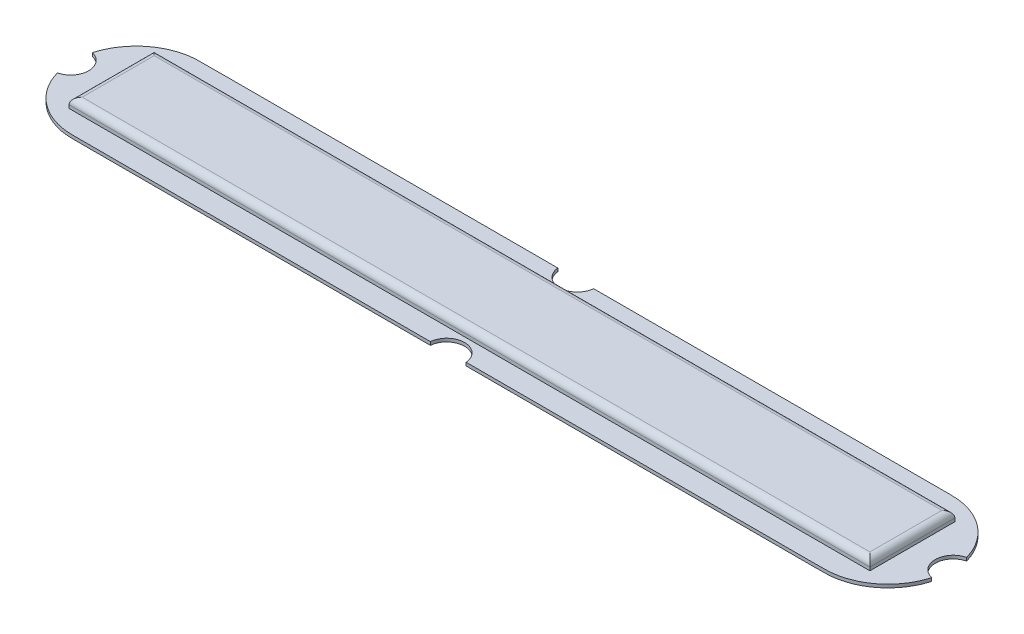
ISO-10303-21;
HEADER;
FILE_DESCRIPTION(('STEP AP214'),'2;1');
FILE_NAME('part.step','',(''),(''),'','','');
FILE_SCHEMA(('AUTOMOTIVE_DESIGN { 1 0 10303 214 1 1 1 1 }'));
ENDSEC;
DATA;
#1=APPLICATION_CONTEXT('core data for automotive mechanical design processes');
#2=APPLICATION_PROTOCOL_DEFINITION('international standard','automotive_design',2000,#1);
#3=PRODUCT_CONTEXT('',#1,'mechanical');
#4=PRODUCT('Part','Part','',(#3));
#5=PRODUCT_RELATED_PRODUCT_CATEGORY('part','',(#4));
#6=PRODUCT_DEFINITION_FORMATION('','',#4);
#7=PRODUCT_DEFINITION_CONTEXT('part definition',#1,'design');
#8=PRODUCT_DEFINITION('design','',#6,#7);
#9=PRODUCT_DEFINITION_SHAPE('','',#8);
#10=(LENGTH_UNIT() NAMED_UNIT(*) SI_UNIT(.MILLI.,.METRE.));
#11=(NAMED_UNIT(*) PLANE_ANGLE_UNIT() SI_UNIT($,.RADIAN.));
#12=(NAMED_UNIT(*) SI_UNIT($,.STERADIAN.) SOLID_ANGLE_UNIT());
#13=UNCERTAINTY_MEASURE_WITH_UNIT(LENGTH_MEASURE(1.E-05),#10,'distance_accuracy_value','');
#14=(GEOMETRIC_REPRESENTATION_CONTEXT(3) GLOBAL_UNCERTAINTY_ASSIGNED_CONTEXT((#13)) GLOBAL_UNIT_ASSIGNED_CONTEXT((#10,
#11,#12)) REPRESENTATION_CONTEXT('',''));
#15=CARTESIAN_POINT('',(0.,0.,0.));
#16=DIRECTION('',(0.,0.,1.));
#17=DIRECTION('',(1.,0.,0.));
#18=AXIS2_PLACEMENT_3D('',#15,#16,#17);
#19=CARTESIAN_POINT('',(-73.1613598107706,10.,-19.5));
#20=DIRECTION('',(0.,1.,0.));
#21=DIRECTION('',(0.,0.,1.));
#22=AXIS2_PLACEMENT_3D('',#19,#20,#21);
#23=PLANE('',#22);
#24=CARTESIAN_POINT('',(-5.47722557505168,10.,-19.5));
#25=CARTESIAN_POINT('',(-11.1175700946949,10.,-19.5));
#26=CARTESIAN_POINT('',(-22.3982591207493,10.,-19.4999997532564));
#27=CARTESIAN_POINT('',(-39.3192927392238,10.,-19.5000008636026));
#28=CARTESIAN_POINT('',(-56.2403260798226,10.,-19.4999967923333));
#29=CARTESIAN_POINT('',(-70.3411880570799,10.,-19.5000094379422));
#30=CARTESIAN_POINT('',(-81.6218757136036,10.,-19.4999836532373));
#31=CARTESIAN_POINT('',(-90.0823967157877,10.,-19.5000623952849));
#32=CARTESIAN_POINT('',(-97.1328141538379,10.,-19.4998160372334));
#33=CARTESIAN_POINT('',(-102.77318562743,10.,-19.500318653923));
#34=CARTESIAN_POINT('',(-107.00336170143,10.,-19.4987836929024));
#35=CARTESIAN_POINT('',(-110.528834565764,10.,-19.5035860942065));
#36=CARTESIAN_POINT('',(-113.348481396427,10.,-19.4937882918478));
#37=CARTESIAN_POINT('',(-115.465215220237,10.,-19.523710188992));
#38=CARTESIAN_POINT('',(-117.510158096948,10.,-19.3759868671878));
#39=CARTESIAN_POINT('',(-120.24462207219,10.,-18.8693473960732));
#40=CARTESIAN_POINT('',(-123.467668243245,10.,-17.7272797087247));
#41=CARTESIAN_POINT('',(-126.433314919999,10.,-15.9003128577728));
#42=CARTESIAN_POINT('',(-128.502764702376,10.,-14.1188749247687));
#43=CARTESIAN_POINT('',(-130.407400240784,10.,-12.0922827703896));
#44=CARTESIAN_POINT('',(-132.325821945017,10.,-9.25938753219543));
#45=CARTESIAN_POINT('',(-133.372141821826,10.,-6.67826096194097));
#46=CARTESIAN_POINT('',(-133.750026366861,10.,-5.35607747483706));
#47=B_SPLINE_CURVE_WITH_KNOTS('',3,(#24,#25,#26,#27,#28,#29,#30,#31,#32,#33,#34,#35,#36,#37,#38,
#39,#40,#41,#42,#43,#44,#45,#46),.UNSPECIFIED.,.F.,.F.,(4,1,1,1,1,1,1,1,1,1,1,1,1,1,1,1,1,1,1,1,
4),(0.00349872527480277,0.127553367111641,0.25160800894848,0.375662650785319,0.499717292622158,
0.561744613540577,0.623771934458996,0.685799255377416,0.716812915836625,0.747826576295835,
0.778840236755045,0.79434706698465,0.809853897214254,0.825360727443859,0.840867557673464,
0.871881218132674,0.902894878591884,0.918401708821488,0.933908539051093,0.964922199510303,
0.995935859969513),.UNSPECIFIED.);
#48=CARTESIAN_POINT('',(-5.47722557505169,10.,-19.5));
#49=VERTEX_POINT('',#48);
#50=CARTESIAN_POINT('',(-133.750026366861,10.,-5.35607747483707));
#51=VERTEX_POINT('',#50);
#52=EDGE_CURVE('E312',#49,#51,#47,.T.);
#53=ORIENTED_EDGE('',*,*,#52,.T.);
#54=CARTESIAN_POINT('',(-135.,10.,0.));
#55=DIRECTION('',(0.,-1.,0.));
#56=DIRECTION('',(0.,0.,1.));
#57=AXIS2_PLACEMENT_3D('',#54,#55,#56);
#58=CIRCLE('',#57,5.49999999999992);
#59=CARTESIAN_POINT('',(-133.750109600661,10.,5.35609689882842));
#60=VERTEX_POINT('',#59);
#61=EDGE_CURVE('E318',#51,#60,#58,.T.);
#62=ORIENTED_EDGE('',*,*,#61,.T.);
#63=CARTESIAN_POINT('',(-133.750109600661,10.,5.35609689882842));
#64=CARTESIAN_POINT('',(-133.376520000912,10.,6.66465796997543));
#65=CARTESIAN_POINT('',(-132.350474968361,10.,9.20947653463909));
#66=CARTESIAN_POINT('',(-130.051571542471,10.,12.6254400261871));
#67=CARTESIAN_POINT('',(-127.068463730669,10.,15.4984996828334));
#68=CARTESIAN_POINT('',(-123.598690120506,10.,17.6621998946385));
#69=CARTESIAN_POINT('',(-119.694318698429,10.,19.0757349435468));
#70=CARTESIAN_POINT('',(-116.334372976419,10.,19.5336566867422));
#71=CARTESIAN_POINT('',(-113.51782129607,10.,19.4937933572259));
#72=CARTESIAN_POINT('',(-110.691296885371,10.,19.5035831699025));
#73=CARTESIAN_POINT('',(-107.161562967157,10.,19.498784684748));
#74=CARTESIAN_POINT('',(-102.924417704055,10.,19.5003183940745));
#75=CARTESIAN_POINT('',(-97.2754022768871,10.,19.499816187247));
#76=CARTESIAN_POINT('',(-90.2139574687782,10.,19.5000623444043));
#77=CARTESIAN_POINT('',(-81.740298829511,10.,19.4999836665673));
#78=CARTESIAN_POINT('',(-70.4420610662004,10.,19.500009430246));
#79=CARTESIAN_POINT('',(-56.3192728680618,10.,19.4999967949491));
#80=CARTESIAN_POINT('',(-39.3719231679285,10.,19.5000008628983));
#81=CARTESIAN_POINT('',(-22.4245745076633,10.,19.4999997534576));
#82=CARTESIAN_POINT('',(-11.1263418694164,10.,19.5));
#83=CARTESIAN_POINT('',(-5.47722557505169,10.,19.5));
#84=B_SPLINE_CURVE_WITH_KNOTS('',3,(#63,#64,#65,#66,#67,#68,#69,#70,#71,#72,#73,#74,#75,#76,#77,
#78,#79,#80,#81,#82,#83),.UNSPECIFIED.,.F.,.F.,(4,1,1,1,1,1,1,1,1,1,1,1,1,1,1,1,1,1,4),
(0.00408033224013704,0.0350936576444537,0.0661069830487705,0.0971203084530873,0.128133633857404,
0.159146959261721,0.190160284666037,0.205666947368196,0.221173610070354,0.252186935474671,
0.283200260878988,0.314213586283304,0.376240237091938,0.438266887900571,0.500293538709205,
0.624346840326472,0.748400141943739,0.872453443561006,0.996506745178273),.UNSPECIFIED.);
#85=CARTESIAN_POINT('',(-5.47722557505168,10.,19.5));
#86=VERTEX_POINT('',#85);
#87=EDGE_CURVE('E609',#60,#86,#84,.T.);
#88=ORIENTED_EDGE('',*,*,#87,.T.);
#89=CARTESIAN_POINT('',(0.,10.,20.));
#90=DIRECTION('',(0.,-1.,0.));
#91=DIRECTION('',(0.,0.,1.));
#92=AXIS2_PLACEMENT_3D('',#89,#90,#91);
#93=CIRCLE('',#92,5.50000000000002);
#94=CARTESIAN_POINT('',(5.47722557505168,10.,19.5));
#95=VERTEX_POINT('',#94);
#96=EDGE_CURVE('E619',#86,#95,#93,.T.);
#97=ORIENTED_EDGE('',*,*,#96,.T.);
#98=CARTESIAN_POINT('',(5.47722557505168,10.,19.5));
#99=CARTESIAN_POINT('',(11.1310034454678,10.,19.5));
#100=CARTESIAN_POINT('',(22.4385588442013,10.,19.4999997625897));
#101=CARTESIAN_POINT('',(39.399893994894,10.,19.5000008309361));
#102=CARTESIAN_POINT('',(56.3612219615131,10.,19.4999969136661));
#103=CARTESIAN_POINT('',(70.4956841701143,10.,19.5000090809442));
#104=CARTESIAN_POINT('',(81.8032041616272,10.,19.4999842715673));
#105=CARTESIAN_POINT('',(90.2839801395151,10.,19.5000600351308));
#106=CARTESIAN_POINT('',(97.3508609133141,10.,19.4998229957795));
#107=CARTESIAN_POINT('',(103.005335638885,10.,19.5003066005706));
#108=CARTESIAN_POINT('',(107.243540888132,10.,19.4988297007401));
#109=CARTESIAN_POINT('',(110.734505365228,10.,19.5034504471808));
#110=CARTESIAN_POINT('',(113.539078586777,10.,19.4940232549265));
#111=CARTESIAN_POINT('',(115.631627521688,10.,19.5228133311767));
#112=CARTESIAN_POINT('',(117.666909720599,10.,19.3534773790679));
#113=CARTESIAN_POINT('',(120.374879064233,10.,18.8319336097943));
#114=CARTESIAN_POINT('',(123.570632555732,10.,17.6754106476036));
#115=CARTESIAN_POINT('',(126.504706465664,10.,15.8472945336236));
#116=CARTESIAN_POINT('',(128.553608335387,10.,14.0694307908965));
#117=CARTESIAN_POINT('',(130.438722852106,10.,12.0503511616809));
#118=CARTESIAN_POINT('',(132.337391776956,10.,9.2334548131252));
#119=CARTESIAN_POINT('',(133.374709676179,10.,6.66926872893134));
#120=CARTESIAN_POINT('',(133.750025976411,10.,5.35607738371595));
#121=B_SPLINE_CURVE_WITH_KNOTS('',3,(#98,#99,#100,#101,#102,#103,#104,#105,#106,#107,#108,#109,
#110,#111,#112,#113,#114,#115,#116,#117,#118,#119,#120),.UNSPECIFIED.,.F.,.F.,(4,1,1,1,1,1,1,1,
1,1,1,1,1,1,1,1,1,1,1,1,4),(0.00349034342763244,0.127542536748357,0.251594730069081,
0.375646923389805,0.499699116710529,0.561725213370891,0.623751310031253,0.685777406691615,
0.716790455021796,0.747803503351977,0.778816551682158,0.794323075847249,0.809829600012339,
0.82533612417743,0.84084264834252,0.871855696672701,0.902868745002883,0.918375269167973,
0.933881793333064,0.964894841663245,0.995907889993426),.UNSPECIFIED.);
#122=CARTESIAN_POINT('',(133.750025976411,10.,5.35607738371595));
#123=VERTEX_POINT('',#122);
#124=EDGE_CURVE('E617',#95,#123,#121,.T.);
#125=ORIENTED_EDGE('',*,*,#124,.T.);
#126=CARTESIAN_POINT('',(135.,10.,0.));
#127=DIRECTION('',(0.,-1.,0.));
#128=DIRECTION('',(0.,0.,1.));
#129=AXIS2_PLACEMENT_3D('',#126,#127,#128);
#130=CIRCLE('',#129,5.50000000000006);
#131=CARTESIAN_POINT('',(133.75011021416,10.,-5.35609704199375));
#132=VERTEX_POINT('',#131);
#133=EDGE_CURVE('E378',#123,#132,#130,.T.);
#134=ORIENTED_EDGE('',*,*,#133,.T.);
#135=CARTESIAN_POINT('',(133.75011021416,10.,-5.35609704199375));
#136=CARTESIAN_POINT('',(133.374700054609,10.,-6.67104573831455));
#137=CARTESIAN_POINT('',(132.342170196369,10.,-9.2280982853344));
#138=CARTESIAN_POINT('',(130.026926469901,10.,-12.6568305498406));
#139=CARTESIAN_POINT('',(127.022036065222,10.,-15.5366088676584));
#140=CARTESIAN_POINT('',(123.525583638664,10.,-17.6986137866578));
#141=CARTESIAN_POINT('',(120.255766854204,10.,-18.8669038365577));
#142=CARTESIAN_POINT('',(117.538613475173,10.,-19.3717288956152));
#143=CARTESIAN_POINT('',(115.4850687448,10.,-19.5240504698128));
#144=CARTESIAN_POINT('',(113.370882859133,10.,-19.4936991434589));
#145=CARTESIAN_POINT('',(110.549692340941,10.,-19.5036375606491));
#146=CARTESIAN_POINT('',(107.023985079067,10.,-19.4987662368637));
#147=CARTESIAN_POINT('',(102.792802118619,10.,-19.5003232271391));
#148=CARTESIAN_POINT('',(97.1513415945686,10.,-19.4998133970604));
#149=CARTESIAN_POINT('',(90.0994758809011,10.,-19.5000632907615));
#150=CARTESIAN_POINT('',(81.6372541709813,10.,-19.4999834186339));
#151=CARTESIAN_POINT('',(70.3542859015446,10.,-19.5000095733925));
#152=CARTESIAN_POINT('',(56.2505776201227,10.,-19.499996746298));
#153=CARTESIAN_POINT('',(39.3261268009365,10.,-19.5000008759967));
#154=CARTESIAN_POINT('',(22.4016762190719,10.,-19.4999997497152));
#155=CARTESIAN_POINT('',(11.1187091192914,10.,-19.5));
#156=CARTESIAN_POINT('',(5.47722557505169,10.,-19.5));
#157=B_SPLINE_CURVE_WITH_KNOTS('',3,(#135,#136,#137,#138,#139,#140,#141,#142,#143,#144,#145,
#146,#147,#148,#149,#150,#151,#152,#153,#154,#155,#156),.UNSPECIFIED.,.F.,.F.,(4,1,1,1,1,1,1,1,
1,1,1,1,1,1,1,1,1,1,1,4),(0.00406062800505813,0.035074419826997,0.0660882116489359,
0.0971020034708748,0.128115795292814,0.159129587114753,0.174636483025722,0.190143378936692,
0.205650274847661,0.22115717075863,0.252170962580569,0.283184754402508,0.314198546224447,
0.376226129868325,0.438253713512203,0.50028129715608,0.624336464443836,0.748391631731592,
0.872446799019347,0.996501966307103),.UNSPECIFIED.);
#158=CARTESIAN_POINT('',(5.47722557505169,10.,-19.5));
#159=VERTEX_POINT('',#158);
#160=EDGE_CURVE('E371',#132,#159,#157,.T.);
#161=ORIENTED_EDGE('',*,*,#160,.T.);
#162=CARTESIAN_POINT('',(0.,10.,-20.));
#163=DIRECTION('',(0.,-1.,0.));
#164=DIRECTION('',(0.,0.,1.));
#165=AXIS2_PLACEMENT_3D('',#162,#163,#164);
#166=CIRCLE('',#165,5.50000000000003);
#167=EDGE_CURVE('E377',#159,#49,#166,.T.);
#168=ORIENTED_EDGE('',*,*,#167,.T.);
#169=EDGE_LOOP('',(#53,#62,#88,#97,#125,#134,#161,#168));
#170=FACE_BOUND('',#169,.T.);
#171=DIRECTION('',(0.,0.,-1.));
#172=VECTOR('',#171,1.);
#173=CARTESIAN_POINT('',(122.5,10.,13.));
#174=LINE('',#173,#172);
#175=CARTESIAN_POINT('',(122.5,10.,13.));
#176=VERTEX_POINT('',#175);
#177=CARTESIAN_POINT('',(122.5,10.,-13.));
#178=VERTEX_POINT('',#177);
#179=EDGE_CURVE('E298',#176,#178,#174,.T.);
#180=ORIENTED_EDGE('',*,*,#179,.F.);
#181=DIRECTION('',(1.,0.,0.));
#182=VECTOR('',#181,1.);
#183=CARTESIAN_POINT('',(-122.5,10.,13.));
#184=LINE('',#183,#182);
#185=CARTESIAN_POINT('',(-122.5,10.,13.));
#186=VERTEX_POINT('',#185);
#187=EDGE_CURVE('E283',#186,#176,#184,.T.);
#188=ORIENTED_EDGE('',*,*,#187,.F.);
#189=DIRECTION('',(0.,0.,-1.));
#190=VECTOR('',#189,1.);
#191=CARTESIAN_POINT('',(-122.5,10.,13.));
#192=LINE('',#191,#190);
#193=CARTESIAN_POINT('',(-122.5,10.,-13.));
#194=VERTEX_POINT('',#193);
#195=EDGE_CURVE('E290',#186,#194,#192,.T.);
#196=ORIENTED_EDGE('',*,*,#195,.T.);
#197=DIRECTION('',(1.,0.,0.));
#198=VECTOR('',#197,1.);
#199=CARTESIAN_POINT('',(-122.5,10.,-13.));
#200=LINE('',#199,#198);
#201=EDGE_CURVE('E301',#194,#178,#200,.T.);
#202=ORIENTED_EDGE('',*,*,#201,.T.);
#203=EDGE_LOOP('',(#180,#188,#196,#202));
#204=FACE_BOUND('',#203,.T.);
#205=ADVANCED_FACE('F178',(#170,#204),#23,.T.);
#206=DIRECTION('',(0.,-1.,0.));
#207=VECTOR('',#206,1.);
#208=SURFACE_OF_LINEAR_EXTRUSION('',#47,#207);
#209=CARTESIAN_POINT('',(-5.47722557505168,9.,-19.5));
#210=CARTESIAN_POINT('',(-11.1175700946949,9.,-19.5));
#211=CARTESIAN_POINT('',(-22.3982591207493,9.,-19.4999997532564));
#212=CARTESIAN_POINT('',(-39.3192927392238,9.,-19.5000008636026));
#213=CARTESIAN_POINT('',(-56.2403260798226,9.,-19.4999967923333));
#214=CARTESIAN_POINT('',(-70.3411880570799,9.,-19.5000094379422));
#215=CARTESIAN_POINT('',(-81.6218757136036,9.,-19.4999836532373));
#216=CARTESIAN_POINT('',(-90.0823967157877,9.,-19.5000623952849));
#217=CARTESIAN_POINT('',(-97.1328141538379,9.,-19.4998160372334));
#218=CARTESIAN_POINT('',(-102.77318562743,9.,-19.500318653923));
#219=CARTESIAN_POINT('',(-107.00336170143,9.,-19.4987836929024));
#220=CARTESIAN_POINT('',(-110.528834565764,9.,-19.5035860942065));
#221=CARTESIAN_POINT('',(-113.348481396427,9.,-19.4937882918478));
#222=CARTESIAN_POINT('',(-115.465215220237,9.,-19.523710188992));
#223=CARTESIAN_POINT('',(-117.510158096948,9.,-19.3759868671878));
#224=CARTESIAN_POINT('',(-120.24462207219,9.,-18.8693473960732));
#225=CARTESIAN_POINT('',(-123.467668243245,9.,-17.7272797087247));
#226=CARTESIAN_POINT('',(-126.433314919999,9.,-15.9003128577728));
#227=CARTESIAN_POINT('',(-128.502764702376,9.,-14.1188749247687));
#228=CARTESIAN_POINT('',(-130.407400240784,9.,-12.0922827703896));
#229=CARTESIAN_POINT('',(-132.325821945017,9.,-9.25938753219543));
#230=CARTESIAN_POINT('',(-133.372141821826,9.,-6.67826096194097));
#231=CARTESIAN_POINT('',(-133.750026366861,9.,-5.35607747483706));
#232=B_SPLINE_CURVE_WITH_KNOTS('',3,(#209,#210,#211,#212,#213,#214,#215,#216,#217,#218,#219,
#220,#221,#222,#223,#224,#225,#226,#227,#228,#229,#230,#231),.UNSPECIFIED.,.F.,.F.,(4,1,1,1,1,1,
1,1,1,1,1,1,1,1,1,1,1,1,1,1,4),(0.00349872527480277,0.127553367111641,0.25160800894848,
0.375662650785319,0.499717292622158,0.561744613540577,0.623771934458996,0.685799255377416,
0.716812915836625,0.747826576295835,0.778840236755045,0.79434706698465,0.809853897214254,
0.825360727443859,0.840867557673464,0.871881218132674,0.902894878591884,0.918401708821488,
0.933908539051093,0.964922199510303,0.995935859969513),.UNSPECIFIED.);
#233=CARTESIAN_POINT('',(-5.47722557505169,9.,-19.5));
#234=VERTEX_POINT('',#233);
#235=CARTESIAN_POINT('',(-133.750026366861,9.,-5.35607747483707));
#236=VERTEX_POINT('',#235);
#237=EDGE_CURVE('E311',#234,#236,#232,.T.);
#238=ORIENTED_EDGE('',*,*,#237,.T.);
#239=DIRECTION('',(0.,-1.,0.));
#240=VECTOR('',#239,1.);
#241=CARTESIAN_POINT('',(-133.750026366861,10.,-5.35607747483707));
#242=LINE('',#241,#240);
#243=EDGE_CURVE('E440',#51,#236,#242,.T.);
#244=ORIENTED_EDGE('',*,*,#243,.F.);
#245=ORIENTED_EDGE('',*,*,#52,.F.);
#246=DIRECTION('',(0.,-1.,0.));
#247=VECTOR('',#246,1.);
#248=CARTESIAN_POINT('',(-5.47722557505169,10.,-19.5));
#249=LINE('',#248,#247);
#250=EDGE_CURVE('E384',#49,#234,#249,.T.);
#251=ORIENTED_EDGE('',*,*,#250,.T.);
#252=EDGE_LOOP('',(#238,#244,#245,#251));
#253=FACE_BOUND('',#252,.T.);
#254=ADVANCED_FACE('F325',(#253),#208,.F.);
#255=CARTESIAN_POINT('',(-135.,10.,0.));
#256=DIRECTION('',(0.,-1.,0.));
#257=DIRECTION('',(0.,0.,-1.));
#258=AXIS2_PLACEMENT_3D('',#255,#256,#257);
#259=CYLINDRICAL_SURFACE('',#258,5.49999999999992);
#260=CARTESIAN_POINT('',(-135.,9.,0.));
#261=DIRECTION('',(0.,-1.,0.));
#262=DIRECTION('',(0.,0.,1.));
#263=AXIS2_PLACEMENT_3D('',#260,#261,#262);
#264=CIRCLE('',#263,5.49999999999992);
#265=CARTESIAN_POINT('',(-133.750109600661,9.,5.35609689882842));
#266=VERTEX_POINT('',#265);
#267=EDGE_CURVE('E389',#236,#266,#264,.T.);
#268=ORIENTED_EDGE('',*,*,#267,.T.);
#269=DIRECTION('',(0.,-1.,0.));
#270=VECTOR('',#269,1.);
#271=CARTESIAN_POINT('',(-133.750109600661,10.,5.35609689882842));
#272=LINE('',#271,#270);
#273=EDGE_CURVE('E437',#60,#266,#272,.T.);
#274=ORIENTED_EDGE('',*,*,#273,.F.);
#275=ORIENTED_EDGE('',*,*,#61,.F.);
#276=ORIENTED_EDGE('',*,*,#243,.T.);
#277=EDGE_LOOP('',(#268,#274,#275,#276));
#278=FACE_BOUND('',#277,.T.);
#279=ADVANCED_FACE('F329',(#278),#259,.F.);
#280=DIRECTION('',(0.,-1.,0.));
#281=VECTOR('',#280,1.);
#282=SURFACE_OF_LINEAR_EXTRUSION('',#84,#281);
#283=CARTESIAN_POINT('',(-133.750109600661,9.,5.35609689882842));
#284=CARTESIAN_POINT('',(-133.376520000912,9.,6.66465796997543));
#285=CARTESIAN_POINT('',(-132.350474968361,9.,9.20947653463909));
#286=CARTESIAN_POINT('',(-130.051571542471,9.,12.6254400261871));
#287=CARTESIAN_POINT('',(-127.068463730669,9.,15.4984996828334));
#288=CARTESIAN_POINT('',(-123.598690120506,9.,17.6621998946385));
#289=CARTESIAN_POINT('',(-119.694318698429,9.,19.0757349435468));
#290=CARTESIAN_POINT('',(-116.334372976419,9.,19.5336566867422));
#291=CARTESIAN_POINT('',(-113.51782129607,9.,19.4937933572259));
#292=CARTESIAN_POINT('',(-110.691296885371,9.,19.5035831699025));
#293=CARTESIAN_POINT('',(-107.161562967157,9.,19.498784684748));
#294=CARTESIAN_POINT('',(-102.924417704055,9.,19.5003183940745));
#295=CARTESIAN_POINT('',(-97.2754022768871,9.,19.499816187247));
#296=CARTESIAN_POINT('',(-90.2139574687782,9.,19.5000623444043));
#297=CARTESIAN_POINT('',(-81.740298829511,9.,19.4999836665673));
#298=CARTESIAN_POINT('',(-70.4420610662004,9.,19.500009430246));
#299=CARTESIAN_POINT('',(-56.3192728680618,9.,19.4999967949491));
#300=CARTESIAN_POINT('',(-39.3719231679285,9.,19.5000008628983));
#301=CARTESIAN_POINT('',(-22.4245745076633,9.,19.4999997534576));
#302=CARTESIAN_POINT('',(-11.1263418694164,9.,19.5));
#303=CARTESIAN_POINT('',(-5.47722557505169,9.,19.5));
#304=B_SPLINE_CURVE_WITH_KNOTS('',3,(#283,#284,#285,#286,#287,#288,#289,#290,#291,#292,#293,
#294,#295,#296,#297,#298,#299,#300,#301,#302,#303),.UNSPECIFIED.,.F.,.F.,(4,1,1,1,1,1,1,1,1,1,1,
1,1,1,1,1,1,1,4),(0.00408033224013704,0.0350936576444537,0.0661069830487705,0.0971203084530873,
0.128133633857404,0.159146959261721,0.190160284666037,0.205666947368196,0.221173610070354,
0.252186935474671,0.283200260878988,0.314213586283304,0.376240237091938,0.438266887900571,
0.500293538709205,0.624346840326472,0.748400141943739,0.872453443561006,0.996506745178273),.UNSPECIFIED.);
#305=CARTESIAN_POINT('',(-5.47722557505168,9.,19.5));
#306=VERTEX_POINT('',#305);
#307=EDGE_CURVE('E394',#266,#306,#304,.T.);
#308=ORIENTED_EDGE('',*,*,#307,.T.);
#309=DIRECTION('',(0.,-1.,0.));
#310=VECTOR('',#309,1.);
#311=CARTESIAN_POINT('',(-5.47722557505168,10.,19.5));
#312=LINE('',#311,#310);
#313=EDGE_CURVE('E434',#86,#306,#312,.T.);
#314=ORIENTED_EDGE('',*,*,#313,.F.);
#315=ORIENTED_EDGE('',*,*,#87,.F.);
#316=ORIENTED_EDGE('',*,*,#273,.T.);
#317=EDGE_LOOP('',(#308,#314,#315,#316));
#318=FACE_BOUND('',#317,.T.);
#319=ADVANCED_FACE('F572',(#318),#282,.F.);
#320=CARTESIAN_POINT('',(0.,10.,20.));
#321=DIRECTION('',(0.,-1.,0.));
#322=DIRECTION('',(0.,0.,-1.));
#323=AXIS2_PLACEMENT_3D('',#320,#321,#322);
#324=CYLINDRICAL_SURFACE('',#323,5.50000000000002);
#325=CARTESIAN_POINT('',(0.,9.,20.));
#326=DIRECTION('',(0.,-1.,0.));
#327=DIRECTION('',(0.,0.,1.));
#328=AXIS2_PLACEMENT_3D('',#325,#326,#327);
#329=CIRCLE('',#328,5.50000000000002);
#330=CARTESIAN_POINT('',(5.47722557505168,9.,19.5));
#331=VERTEX_POINT('',#330);
#332=EDGE_CURVE('E398',#306,#331,#329,.T.);
#333=ORIENTED_EDGE('',*,*,#332,.T.);
#334=DIRECTION('',(0.,-1.,0.));
#335=VECTOR('',#334,1.);
#336=CARTESIAN_POINT('',(5.47722557505168,10.,19.5));
#337=LINE('',#336,#335);
#338=EDGE_CURVE('E431',#95,#331,#337,.T.);
#339=ORIENTED_EDGE('',*,*,#338,.F.);
#340=ORIENTED_EDGE('',*,*,#96,.F.);
#341=ORIENTED_EDGE('',*,*,#313,.T.);
#342=EDGE_LOOP('',(#333,#339,#340,#341));
#343=FACE_BOUND('',#342,.T.);
#344=ADVANCED_FACE('F564',(#343),#324,.F.);
#345=DIRECTION('',(0.,-1.,0.));
#346=VECTOR('',#345,1.);
#347=SURFACE_OF_LINEAR_EXTRUSION('',#121,#346);
#348=CARTESIAN_POINT('',(5.47722557505168,9.,19.5));
#349=CARTESIAN_POINT('',(11.1310034454678,9.,19.5));
#350=CARTESIAN_POINT('',(22.4385588442013,9.,19.4999997625897));
#351=CARTESIAN_POINT('',(39.399893994894,9.,19.5000008309361));
#352=CARTESIAN_POINT('',(56.3612219615131,9.,19.4999969136661));
#353=CARTESIAN_POINT('',(70.4956841701143,9.,19.5000090809442));
#354=CARTESIAN_POINT('',(81.8032041616272,9.,19.4999842715673));
#355=CARTESIAN_POINT('',(90.2839801395151,9.,19.5000600351308));
#356=CARTESIAN_POINT('',(97.3508609133141,9.,19.4998229957795));
#357=CARTESIAN_POINT('',(103.005335638885,9.,19.5003066005706));
#358=CARTESIAN_POINT('',(107.243540888132,9.,19.4988297007401));
#359=CARTESIAN_POINT('',(110.734505365228,9.,19.5034504471808));
#360=CARTESIAN_POINT('',(113.539078586777,9.,19.4940232549265));
#361=CARTESIAN_POINT('',(115.631627521688,9.,19.5228133311767));
#362=CARTESIAN_POINT('',(117.666909720599,9.,19.3534773790679));
#363=CARTESIAN_POINT('',(120.374879064233,9.,18.8319336097943));
#364=CARTESIAN_POINT('',(123.570632555732,9.,17.6754106476036));
#365=CARTESIAN_POINT('',(126.504706465664,9.,15.8472945336236));
#366=CARTESIAN_POINT('',(128.553608335387,9.,14.0694307908965));
#367=CARTESIAN_POINT('',(130.438722852106,9.,12.0503511616809));
#368=CARTESIAN_POINT('',(132.337391776956,9.,9.2334548131252));
#369=CARTESIAN_POINT('',(133.374709676179,9.,6.66926872893134));
#370=CARTESIAN_POINT('',(133.750025976411,9.,5.35607738371595));
#371=B_SPLINE_CURVE_WITH_KNOTS('',3,(#348,#349,#350,#351,#352,#353,#354,#355,#356,#357,#358,
#359,#360,#361,#362,#363,#364,#365,#366,#367,#368,#369,#370),.UNSPECIFIED.,.F.,.F.,(4,1,1,1,1,1,
1,1,1,1,1,1,1,1,1,1,1,1,1,1,4),(0.00349034342763244,0.127542536748357,0.251594730069081,
0.375646923389805,0.499699116710529,0.561725213370891,0.623751310031253,0.685777406691615,
0.716790455021796,0.747803503351977,0.778816551682158,0.794323075847249,0.809829600012339,
0.82533612417743,0.84084264834252,0.871855696672701,0.902868745002883,0.918375269167973,
0.933881793333064,0.964894841663245,0.995907889993426),.UNSPECIFIED.);
#372=CARTESIAN_POINT('',(133.750025976411,9.,5.35607738371595));
#373=VERTEX_POINT('',#372);
#374=EDGE_CURVE('E403',#331,#373,#371,.T.);
#375=ORIENTED_EDGE('',*,*,#374,.T.);
#376=DIRECTION('',(0.,-1.,0.));
#377=VECTOR('',#376,1.);
#378=CARTESIAN_POINT('',(133.750025976411,10.,5.35607738371595));
#379=LINE('',#378,#377);
#380=EDGE_CURVE('E428',#123,#373,#379,.T.);
#381=ORIENTED_EDGE('',*,*,#380,.F.);
#382=ORIENTED_EDGE('',*,*,#124,.F.);
#383=ORIENTED_EDGE('',*,*,#338,.T.);
#384=EDGE_LOOP('',(#375,#381,#382,#383));
#385=FACE_BOUND('',#384,.T.);
#386=ADVANCED_FACE('F556',(#385),#347,.F.);
#387=CARTESIAN_POINT('',(135.,10.,0.));
#388=DIRECTION('',(0.,-1.,0.));
#389=DIRECTION('',(0.,0.,-1.));
#390=AXIS2_PLACEMENT_3D('',#387,#388,#389);
#391=CYLINDRICAL_SURFACE('',#390,5.50000000000006);
#392=CARTESIAN_POINT('',(135.,9.,0.));
#393=DIRECTION('',(0.,-1.,0.));
#394=DIRECTION('',(0.,0.,1.));
#395=AXIS2_PLACEMENT_3D('',#392,#393,#394);
#396=CIRCLE('',#395,5.50000000000006);
#397=CARTESIAN_POINT('',(133.75011021416,9.,-5.35609704199375));
#398=VERTEX_POINT('',#397);
#399=EDGE_CURVE('E407',#373,#398,#396,.T.);
#400=ORIENTED_EDGE('',*,*,#399,.T.);
#401=DIRECTION('',(0.,-1.,0.));
#402=VECTOR('',#401,1.);
#403=CARTESIAN_POINT('',(133.75011021416,10.,-5.35609704199375));
#404=LINE('',#403,#402);
#405=EDGE_CURVE('E425',#132,#398,#404,.T.);
#406=ORIENTED_EDGE('',*,*,#405,.F.);
#407=ORIENTED_EDGE('',*,*,#133,.F.);
#408=ORIENTED_EDGE('',*,*,#380,.T.);
#409=EDGE_LOOP('',(#400,#406,#407,#408));
#410=FACE_BOUND('',#409,.T.);
#411=ADVANCED_FACE('F368',(#410),#391,.F.);
#412=DIRECTION('',(0.,-1.,0.));
#413=VECTOR('',#412,1.);
#414=SURFACE_OF_LINEAR_EXTRUSION('',#157,#413);
#415=CARTESIAN_POINT('',(133.75011021416,9.,-5.35609704199375));
#416=CARTESIAN_POINT('',(133.374700054609,9.,-6.67104573831455));
#417=CARTESIAN_POINT('',(132.342170196369,9.,-9.2280982853344));
#418=CARTESIAN_POINT('',(130.026926469901,9.,-12.6568305498406));
#419=CARTESIAN_POINT('',(127.022036065222,9.,-15.5366088676584));
#420=CARTESIAN_POINT('',(123.525583638664,9.,-17.6986137866578));
#421=CARTESIAN_POINT('',(120.255766854204,9.,-18.8669038365577));
#422=CARTESIAN_POINT('',(117.538613475173,9.,-19.3717288956152));
#423=CARTESIAN_POINT('',(115.4850687448,9.,-19.5240504698128));
#424=CARTESIAN_POINT('',(113.370882859133,9.,-19.4936991434589));
#425=CARTESIAN_POINT('',(110.549692340941,9.,-19.5036375606491));
#426=CARTESIAN_POINT('',(107.023985079067,9.,-19.4987662368637));
#427=CARTESIAN_POINT('',(102.792802118619,9.,-19.5003232271391));
#428=CARTESIAN_POINT('',(97.1513415945686,9.,-19.4998133970604));
#429=CARTESIAN_POINT('',(90.0994758809011,9.,-19.5000632907615));
#430=CARTESIAN_POINT('',(81.6372541709813,9.,-19.4999834186339));
#431=CARTESIAN_POINT('',(70.3542859015446,9.,-19.5000095733925));
#432=CARTESIAN_POINT('',(56.2505776201227,9.,-19.499996746298));
#433=CARTESIAN_POINT('',(39.3261268009365,9.,-19.5000008759967));
#434=CARTESIAN_POINT('',(22.4016762190719,9.,-19.4999997497152));
#435=CARTESIAN_POINT('',(11.1187091192914,9.,-19.5));
#436=CARTESIAN_POINT('',(5.47722557505169,9.,-19.5));
#437=B_SPLINE_CURVE_WITH_KNOTS('',3,(#415,#416,#417,#418,#419,#420,#421,#422,#423,#424,#425,
#426,#427,#428,#429,#430,#431,#432,#433,#434,#435,#436),.UNSPECIFIED.,.F.,.F.,(4,1,1,1,1,1,1,1,
1,1,1,1,1,1,1,1,1,1,1,4),(0.00406062800505813,0.035074419826997,0.0660882116489359,
0.0971020034708748,0.128115795292814,0.159129587114753,0.174636483025722,0.190143378936692,
0.205650274847661,0.22115717075863,0.252170962580569,0.283184754402508,0.314198546224447,
0.376226129868325,0.438253713512203,0.50028129715608,0.624336464443836,0.748391631731592,
0.872446799019347,0.996501966307103),.UNSPECIFIED.);
#438=CARTESIAN_POINT('',(5.47722557505169,9.,-19.5));
#439=VERTEX_POINT('',#438);
#440=EDGE_CURVE('E412',#398,#439,#437,.T.);
#441=ORIENTED_EDGE('',*,*,#440,.T.);
#442=DIRECTION('',(0.,-1.,0.));
#443=VECTOR('',#442,1.);
#444=CARTESIAN_POINT('',(5.47722557505169,10.,-19.5));
#445=LINE('',#444,#443);
#446=EDGE_CURVE('E422',#159,#439,#445,.T.);
#447=ORIENTED_EDGE('',*,*,#446,.F.);
#448=ORIENTED_EDGE('',*,*,#160,.F.);
#449=ORIENTED_EDGE('',*,*,#405,.T.);
#450=EDGE_LOOP('',(#441,#447,#448,#449));
#451=FACE_BOUND('',#450,.T.);
#452=ADVANCED_FACE('F363',(#451),#414,.F.);
#453=CARTESIAN_POINT('',(0.,10.,-20.));
#454=DIRECTION('',(0.,-1.,0.));
#455=DIRECTION('',(0.,0.,-1.));
#456=AXIS2_PLACEMENT_3D('',#453,#454,#455);
#457=CYLINDRICAL_SURFACE('',#456,5.50000000000003);
#458=CARTESIAN_POINT('',(0.,9.,-20.));
#459=DIRECTION('',(0.,-1.,0.));
#460=DIRECTION('',(0.,0.,1.));
#461=AXIS2_PLACEMENT_3D('',#458,#459,#460);
#462=CIRCLE('',#461,5.50000000000003);
#463=EDGE_CURVE('E319',#439,#234,#462,.T.);
#464=ORIENTED_EDGE('',*,*,#463,.T.);
#465=ORIENTED_EDGE('',*,*,#250,.F.);
#466=ORIENTED_EDGE('',*,*,#167,.F.);
#467=ORIENTED_EDGE('',*,*,#446,.T.);
#468=EDGE_LOOP('',(#464,#465,#466,#467));
#469=FACE_BOUND('',#468,.T.);
#470=ADVANCED_FACE('F359',(#469),#457,.F.);
#471=CARTESIAN_POINT('',(-73.1613598107706,9.,-19.5));
#472=DIRECTION('',(0.,1.,0.));
#473=DIRECTION('',(0.,0.,1.));
#474=AXIS2_PLACEMENT_3D('',#471,#472,#473);
#475=PLANE('',#474);
#476=ORIENTED_EDGE('',*,*,#237,.F.);
#477=ORIENTED_EDGE('',*,*,#463,.F.);
#478=ORIENTED_EDGE('',*,*,#440,.F.);
#479=ORIENTED_EDGE('',*,*,#399,.F.);
#480=ORIENTED_EDGE('',*,*,#374,.F.);
#481=ORIENTED_EDGE('',*,*,#332,.F.);
#482=ORIENTED_EDGE('',*,*,#307,.F.);
#483=ORIENTED_EDGE('',*,*,#267,.F.);
#484=EDGE_LOOP('',(#476,#477,#478,#479,#480,#481,#482,#483));
#485=FACE_BOUND('',#484,.T.);
#486=ADVANCED_FACE('F356',(#485),#475,.F.);
#487=CARTESIAN_POINT('',(-122.5,13.,13.));
#488=DIRECTION('',(0.,0.,-1.));
#489=DIRECTION('',(-1.,0.,0.));
#490=AXIS2_PLACEMENT_3D('',#487,#488,#489);
#491=PLANE('',#490);
#492=DIRECTION('',(0.,-1.,0.));
#493=VECTOR('',#492,1.);
#494=CARTESIAN_POINT('',(122.5,13.,13.));
#495=LINE('',#494,#493);
#496=CARTESIAN_POINT('',(122.5,11.,13.));
#497=VERTEX_POINT('',#496);
#498=EDGE_CURVE('E309',#497,#176,#495,.T.);
#499=ORIENTED_EDGE('',*,*,#498,.F.);
#500=DIRECTION('',(1.,0.,0.));
#501=VECTOR('',#500,1.);
#502=CARTESIAN_POINT('',(-122.5,11.,13.));
#503=LINE('',#502,#501);
#504=CARTESIAN_POINT('',(-122.5,11.,13.));
#505=VERTEX_POINT('',#504);
#506=EDGE_CURVE('E12',#497,#505,#503,.F.);
#507=ORIENTED_EDGE('',*,*,#506,.T.);
#508=DIRECTION('',(0.,-1.,0.));
#509=VECTOR('',#508,1.);
#510=CARTESIAN_POINT('',(-122.5,13.,13.));
#511=LINE('',#510,#509);
#512=EDGE_CURVE('E280',#505,#186,#511,.T.);
#513=ORIENTED_EDGE('',*,*,#512,.T.);
#514=ORIENTED_EDGE('',*,*,#187,.T.);
#515=EDGE_LOOP('',(#499,#507,#513,#514));
#516=FACE_BOUND('',#515,.T.);
#517=ADVANCED_FACE('F282',(#516),#491,.F.);
#518=CARTESIAN_POINT('',(122.5,13.,13.));
#519=DIRECTION('',(-1.,0.,0.));
#520=DIRECTION('',(0.,0.,1.));
#521=AXIS2_PLACEMENT_3D('',#518,#519,#520);
#522=PLANE('',#521);
#523=DIRECTION('',(0.,-1.,0.));
#524=VECTOR('',#523,1.);
#525=CARTESIAN_POINT('',(122.5,13.,-13.));
#526=LINE('',#525,#524);
#527=CARTESIAN_POINT('',(122.5,11.,-13.));
#528=VERTEX_POINT('',#527);
#529=EDGE_CURVE('E307',#528,#178,#526,.T.);
#530=ORIENTED_EDGE('',*,*,#529,.F.);
#531=DIRECTION('',(0.,0.,-1.));
#532=VECTOR('',#531,1.);
#533=CARTESIAN_POINT('',(122.5,11.,13.));
#534=LINE('',#533,#532);
#535=EDGE_CURVE('E187',#528,#497,#534,.F.);
#536=ORIENTED_EDGE('',*,*,#535,.T.);
#537=ORIENTED_EDGE('',*,*,#498,.T.);
#538=ORIENTED_EDGE('',*,*,#179,.T.);
#539=EDGE_LOOP('',(#530,#536,#537,#538));
#540=FACE_BOUND('',#539,.T.);
#541=ADVANCED_FACE('F471',(#540),#522,.F.);
#542=CARTESIAN_POINT('',(-122.5,13.,-13.));
#543=DIRECTION('',(0.,0.,-1.));
#544=DIRECTION('',(-1.,0.,0.));
#545=AXIS2_PLACEMENT_3D('',#542,#543,#544);
#546=PLANE('',#545);
#547=DIRECTION('',(0.,-1.,0.));
#548=VECTOR('',#547,1.);
#549=CARTESIAN_POINT('',(-122.5,13.,-13.));
#550=LINE('',#549,#548);
#551=CARTESIAN_POINT('',(-122.5,11.,-13.));
#552=VERTEX_POINT('',#551);
#553=EDGE_CURVE('E289',#552,#194,#550,.T.);
#554=ORIENTED_EDGE('',*,*,#553,.F.);
#555=DIRECTION('',(1.,0.,0.));
#556=VECTOR('',#555,1.);
#557=CARTESIAN_POINT('',(-122.5,11.,-13.));
#558=LINE('',#557,#556);
#559=EDGE_CURVE('E202',#552,#528,#558,.T.);
#560=ORIENTED_EDGE('',*,*,#559,.T.);
#561=ORIENTED_EDGE('',*,*,#529,.T.);
#562=ORIENTED_EDGE('',*,*,#201,.F.);
#563=EDGE_LOOP('',(#554,#560,#561,#562));
#564=FACE_BOUND('',#563,.T.);
#565=ADVANCED_FACE('F470',(#564),#546,.T.);
#566=CARTESIAN_POINT('',(-122.5,13.,13.));
#567=DIRECTION('',(-1.,0.,0.));
#568=DIRECTION('',(0.,0.,1.));
#569=AXIS2_PLACEMENT_3D('',#566,#567,#568);
#570=PLANE('',#569);
#571=ORIENTED_EDGE('',*,*,#512,.F.);
#572=DIRECTION('',(0.,0.,-1.));
#573=VECTOR('',#572,1.);
#574=CARTESIAN_POINT('',(-122.5,11.,13.));
#575=LINE('',#574,#573);
#576=EDGE_CURVE('E443',#505,#552,#575,.T.);
#577=ORIENTED_EDGE('',*,*,#576,.T.);
#578=ORIENTED_EDGE('',*,*,#553,.T.);
#579=ORIENTED_EDGE('',*,*,#195,.F.);
#580=EDGE_LOOP('',(#571,#577,#578,#579));
#581=FACE_BOUND('',#580,.T.);
#582=ADVANCED_FACE('F300',(#581),#570,.T.);
#583=CARTESIAN_POINT('',(0.,13.,0.));
#584=DIRECTION('',(0.,1.,0.));
#585=DIRECTION('',(0.,0.,1.));
#586=AXIS2_PLACEMENT_3D('',#583,#584,#585);
#587=PLANE('',#586);
#588=DIRECTION('',(1.,0.,0.));
#589=VECTOR('',#588,1.);
#590=CARTESIAN_POINT('',(0.,13.,-11.));
#591=LINE('',#590,#589);
#592=CARTESIAN_POINT('',(120.5,13.,-11.));
#593=VERTEX_POINT('',#592);
#594=CARTESIAN_POINT('',(-120.5,13.,-11.));
#595=VERTEX_POINT('',#594);
#596=EDGE_CURVE('E449',#593,#595,#591,.F.);
#597=ORIENTED_EDGE('',*,*,#596,.T.);
#598=DIRECTION('',(0.,0.,-1.));
#599=VECTOR('',#598,1.);
#600=CARTESIAN_POINT('',(-120.5,13.,0.));
#601=LINE('',#600,#599);
#602=CARTESIAN_POINT('',(-120.5,13.,11.));
#603=VERTEX_POINT('',#602);
#604=EDGE_CURVE('E451',#595,#603,#601,.F.);
#605=ORIENTED_EDGE('',*,*,#604,.T.);
#606=DIRECTION('',(1.,0.,0.));
#607=VECTOR('',#606,1.);
#608=CARTESIAN_POINT('',(122.5,13.,11.));
#609=LINE('',#608,#607);
#610=CARTESIAN_POINT('',(120.5,13.,11.));
#611=VERTEX_POINT('',#610);
#612=EDGE_CURVE('E445',#603,#611,#609,.T.);
#613=ORIENTED_EDGE('',*,*,#612,.T.);
#614=DIRECTION('',(0.,0.,-1.));
#615=VECTOR('',#614,1.);
#616=CARTESIAN_POINT('',(120.5,13.,-13.));
#617=LINE('',#616,#615);
#618=EDGE_CURVE('E447',#611,#593,#617,.T.);
#619=ORIENTED_EDGE('',*,*,#618,.T.);
#620=EDGE_LOOP('',(#597,#605,#613,#619));
#621=FACE_BOUND('',#620,.T.);
#622=ADVANCED_FACE('F345',(#621),#587,.T.);
#623=CARTESIAN_POINT('',(120.5,11.,0.));
#624=DIRECTION('',(0.,0.,1.));
#625=DIRECTION('',(1.,0.,0.));
#626=AXIS2_PLACEMENT_3D('',#623,#624,#625);
#627=CYLINDRICAL_SURFACE('',#626,2.);
#628=CARTESIAN_POINT('',(120.5,11.,-11.));
#629=DIRECTION('',(0.707106781186547,0.,0.707106781186547));
#630=DIRECTION('',(-0.707106781186547,0.,0.707106781186547));
#631=AXIS2_PLACEMENT_3D('',#628,#629,#630);
#632=ELLIPSE('',#631,2.82842712474619,2.);
#633=EDGE_CURVE('E459',#593,#528,#632,.F.);
#634=ORIENTED_EDGE('',*,*,#633,.F.);
#635=ORIENTED_EDGE('',*,*,#618,.F.);
#636=CARTESIAN_POINT('',(120.5,11.,11.));
#637=DIRECTION('',(-0.707106781186547,0.,0.707106781186547));
#638=DIRECTION('',(-0.707106781186547,0.,-0.707106781186547));
#639=AXIS2_PLACEMENT_3D('',#636,#637,#638);
#640=ELLIPSE('',#639,2.82842712474619,2.);
#641=EDGE_CURVE('E182',#497,#611,#640,.T.);
#642=ORIENTED_EDGE('',*,*,#641,.F.);
#643=ORIENTED_EDGE('',*,*,#535,.F.);
#644=EDGE_LOOP('',(#634,#635,#642,#643));
#645=FACE_BOUND('',#644,.T.);
#646=ADVANCED_FACE('F180',(#645),#627,.T.);
#647=CARTESIAN_POINT('',(0.,11.,11.));
#648=DIRECTION('',(-1.,0.,0.));
#649=DIRECTION('',(0.,0.,1.));
#650=AXIS2_PLACEMENT_3D('',#647,#648,#649);
#651=CYLINDRICAL_SURFACE('',#650,2.);
#652=ORIENTED_EDGE('',*,*,#641,.T.);
#653=ORIENTED_EDGE('',*,*,#612,.F.);
#654=CARTESIAN_POINT('',(-120.5,11.,11.));
#655=DIRECTION('',(-0.707106781186547,0.,-0.707106781186547));
#656=DIRECTION('',(-0.707106781186547,0.,0.707106781186547));
#657=AXIS2_PLACEMENT_3D('',#654,#655,#656);
#658=ELLIPSE('',#657,2.82842712474619,2.);
#659=EDGE_CURVE('E458',#505,#603,#658,.T.);
#660=ORIENTED_EDGE('',*,*,#659,.F.);
#661=ORIENTED_EDGE('',*,*,#506,.F.);
#662=EDGE_LOOP('',(#652,#653,#660,#661));
#663=FACE_BOUND('',#662,.T.);
#664=ADVANCED_FACE('F338',(#663),#651,.T.);
#665=CARTESIAN_POINT('',(-122.5,11.,-11.));
#666=DIRECTION('',(1.,0.,0.));
#667=DIRECTION('',(0.,0.,-1.));
#668=AXIS2_PLACEMENT_3D('',#665,#666,#667);
#669=CYLINDRICAL_SURFACE('',#668,2.);
#670=ORIENTED_EDGE('',*,*,#633,.T.);
#671=ORIENTED_EDGE('',*,*,#559,.F.);
#672=CARTESIAN_POINT('',(-120.5,11.,-11.));
#673=DIRECTION('',(0.707106781186547,0.,-0.707106781186547));
#674=DIRECTION('',(0.707106781186547,0.,0.707106781186547));
#675=AXIS2_PLACEMENT_3D('',#672,#673,#674);
#676=ELLIPSE('',#675,2.82842712474619,2.);
#677=EDGE_CURVE('E456',#595,#552,#676,.F.);
#678=ORIENTED_EDGE('',*,*,#677,.F.);
#679=ORIENTED_EDGE('',*,*,#596,.F.);
#680=EDGE_LOOP('',(#670,#671,#678,#679));
#681=FACE_BOUND('',#680,.T.);
#682=ADVANCED_FACE('F335',(#681),#669,.T.);
#683=CARTESIAN_POINT('',(-120.5,11.,13.));
#684=DIRECTION('',(0.,0.,-1.));
#685=DIRECTION('',(-1.,0.,0.));
#686=AXIS2_PLACEMENT_3D('',#683,#684,#685);
#687=CYLINDRICAL_SURFACE('',#686,2.);
#688=ORIENTED_EDGE('',*,*,#659,.T.);
#689=ORIENTED_EDGE('',*,*,#604,.F.);
#690=ORIENTED_EDGE('',*,*,#677,.T.);
#691=ORIENTED_EDGE('',*,*,#576,.F.);
#692=EDGE_LOOP('',(#688,#689,#690,#691));
#693=FACE_BOUND('',#692,.T.);
#694=ADVANCED_FACE('F332',(#693),#687,.T.);
#695=CLOSED_SHELL('',(#205,#254,#279,#319,#344,#386,#411,#452,#470,#486,#517,#541,#565,#582,
#622,#646,#664,#682,#694));
#696=MANIFOLD_SOLID_BREP('B2',#695);
#697=ADVANCED_BREP_SHAPE_REPRESENTATION('',(#18,#696),#14);
#698=SHAPE_DEFINITION_REPRESENTATION(#9,#697);
ENDSEC;
END-ISO-10303-21;
